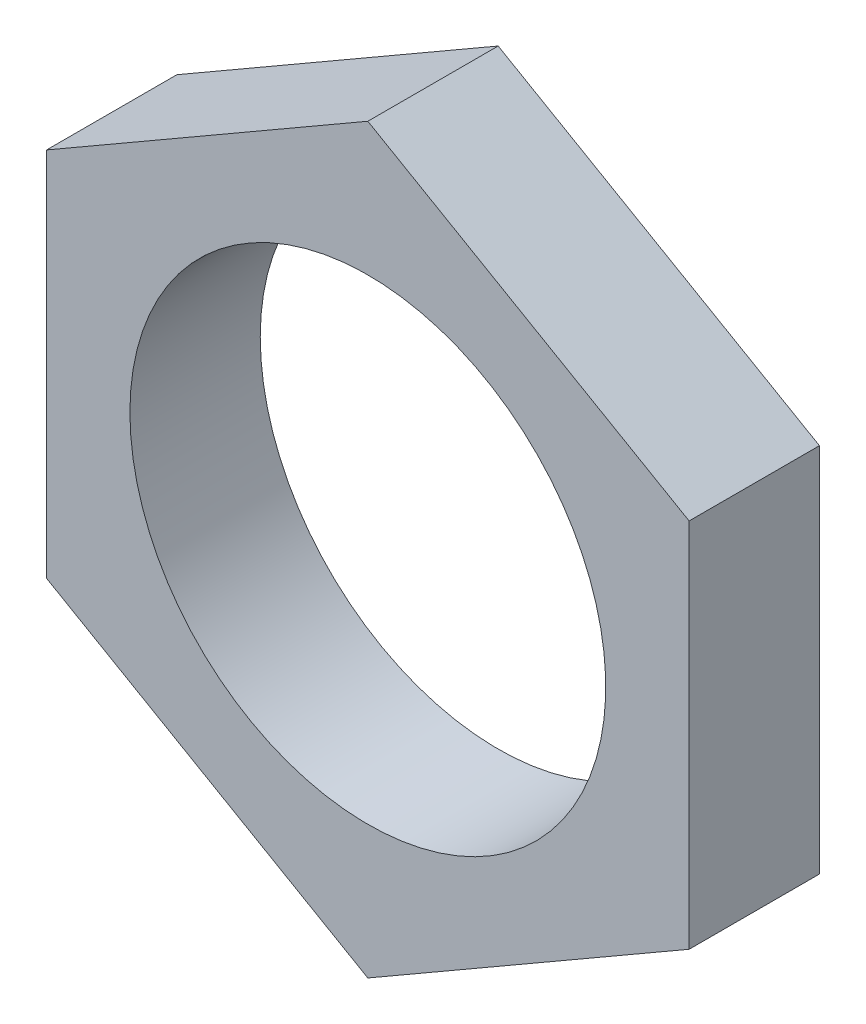
ISO-10303-21;
HEADER;
FILE_DESCRIPTION(('STEP AP214'),'2;1');
FILE_NAME('part.step','',(''),(''),'','','');
FILE_SCHEMA(('AUTOMOTIVE_DESIGN { 1 0 10303 214 1 1 1 1 }'));
ENDSEC;
DATA;
#1=APPLICATION_CONTEXT('core data for automotive mechanical design processes');
#2=APPLICATION_PROTOCOL_DEFINITION('international standard','automotive_design',2000,#1);
#3=PRODUCT_CONTEXT('',#1,'mechanical');
#4=PRODUCT('Part','Part','',(#3));
#5=PRODUCT_RELATED_PRODUCT_CATEGORY('part','',(#4));
#6=PRODUCT_DEFINITION_FORMATION('','',#4);
#7=PRODUCT_DEFINITION_CONTEXT('part definition',#1,'design');
#8=PRODUCT_DEFINITION('design','',#6,#7);
#9=PRODUCT_DEFINITION_SHAPE('','',#8);
#10=(LENGTH_UNIT() NAMED_UNIT(*) SI_UNIT(.MILLI.,.METRE.));
#11=(NAMED_UNIT(*) PLANE_ANGLE_UNIT() SI_UNIT($,.RADIAN.));
#12=(NAMED_UNIT(*) SI_UNIT($,.STERADIAN.) SOLID_ANGLE_UNIT());
#13=UNCERTAINTY_MEASURE_WITH_UNIT(LENGTH_MEASURE(1.E-05),#10,'distance_accuracy_value','');
#14=(GEOMETRIC_REPRESENTATION_CONTEXT(3) GLOBAL_UNCERTAINTY_ASSIGNED_CONTEXT((#13)) GLOBAL_UNIT_ASSIGNED_CONTEXT((#10,
#11,#12)) REPRESENTATION_CONTEXT('',''));
#15=CARTESIAN_POINT('',(0.,0.,0.));
#16=DIRECTION('',(0.,0.,1.));
#17=DIRECTION('',(1.,0.,0.));
#18=AXIS2_PLACEMENT_3D('',#15,#16,#17);
#19=CARTESIAN_POINT('',(-4.28579687329216E-13,-15.5445786476608,5.461));
#20=DIRECTION('',(-0.499999999999952,0.866025403784466,0.));
#21=DIRECTION('',(-0.866025403784466,-0.499999999999952,0.));
#22=AXIS2_PLACEMENT_3D('',#19,#20,#21);
#23=PLANE('',#22);
#24=DIRECTION('',(0.,0.,1.));
#25=VECTOR('',#24,1.);
#26=CARTESIAN_POINT('',(13.462,-7.77228932383074,5.461));
#27=LINE('',#26,#25);
#28=CARTESIAN_POINT('',(13.462,-7.77228932383075,0.));
#29=VERTEX_POINT('',#28);
#30=CARTESIAN_POINT('',(13.462,-7.77228932383076,5.461));
#31=VERTEX_POINT('',#30);
#32=EDGE_CURVE('E66',#29,#31,#27,.T.);
#33=ORIENTED_EDGE('',*,*,#32,.T.);
#34=DIRECTION('',(0.866025403784465,0.499999999999955,0.));
#35=VECTOR('',#34,1.);
#36=CARTESIAN_POINT('',(-4.28476698566271E-13,-15.5445786476608,5.461));
#37=LINE('',#36,#35);
#38=CARTESIAN_POINT('',(-4.2193953280264E-13,-15.5445786476608,5.461));
#39=VERTEX_POINT('',#38);
#40=EDGE_CURVE('E107',#39,#31,#37,.T.);
#41=ORIENTED_EDGE('',*,*,#40,.F.);
#42=DIRECTION('',(0.,0.,1.));
#43=VECTOR('',#42,1.);
#44=CARTESIAN_POINT('',(-3.98986399474666E-13,-15.5445786476607,5.461));
#45=LINE('',#44,#43);
#46=CARTESIAN_POINT('',(-4.13744623765764E-13,-15.5445786476608,0.));
#47=VERTEX_POINT('',#46);
#48=EDGE_CURVE('E94',#39,#47,#45,.F.);
#49=ORIENTED_EDGE('',*,*,#48,.T.);
#50=DIRECTION('',(0.866025403784465,0.499999999999955,0.));
#51=VECTOR('',#50,1.);
#52=CARTESIAN_POINT('',(-4.28476698566271E-13,-15.5445786476608,0.));
#53=LINE('',#52,#51);
#54=EDGE_CURVE('E108',#47,#29,#53,.T.);
#55=ORIENTED_EDGE('',*,*,#54,.T.);
#56=EDGE_LOOP('',(#33,#41,#49,#55));
#57=FACE_BOUND('',#56,.T.);
#58=ADVANCED_FACE('F17',(#57),#23,.F.);
#59=CARTESIAN_POINT('',(13.462,-7.77228932383074,5.461));
#60=DIRECTION('',(-1.,0.,0.));
#61=DIRECTION('',(0.,0.,1.));
#62=AXIS2_PLACEMENT_3D('',#59,#60,#61);
#63=PLANE('',#62);
#64=DIRECTION('',(0.,0.,1.));
#65=VECTOR('',#64,1.);
#66=CARTESIAN_POINT('',(13.462,7.77228932382927,5.461));
#67=LINE('',#66,#65);
#68=CARTESIAN_POINT('',(13.462,7.77228932382927,0.));
#69=VERTEX_POINT('',#68);
#70=CARTESIAN_POINT('',(13.462,7.77228932382927,5.461));
#71=VERTEX_POINT('',#70);
#72=EDGE_CURVE('E73',#69,#71,#67,.T.);
#73=ORIENTED_EDGE('',*,*,#72,.T.);
#74=DIRECTION('',(0.,1.,0.));
#75=VECTOR('',#74,1.);
#76=CARTESIAN_POINT('',(13.462,-7.77228932383074,5.461));
#77=LINE('',#76,#75);
#78=EDGE_CURVE('E109',#31,#71,#77,.T.);
#79=ORIENTED_EDGE('',*,*,#78,.F.);
#80=ORIENTED_EDGE('',*,*,#32,.F.);
#81=DIRECTION('',(0.,1.,0.));
#82=VECTOR('',#81,1.);
#83=CARTESIAN_POINT('',(13.462,-7.77228932383074,0.));
#84=LINE('',#83,#82);
#85=EDGE_CURVE('E87',#29,#69,#84,.T.);
#86=ORIENTED_EDGE('',*,*,#85,.T.);
#87=EDGE_LOOP('',(#73,#79,#80,#86));
#88=FACE_BOUND('',#87,.T.);
#89=ADVANCED_FACE('F93',(#88),#63,.F.);
#90=CARTESIAN_POINT('',(13.462,7.77228932382927,5.461));
#91=DIRECTION('',(-0.499999999999976,-0.866025403784453,0.));
#92=DIRECTION('',(0.866025403784453,-0.499999999999976,0.));
#93=AXIS2_PLACEMENT_3D('',#90,#91,#92);
#94=PLANE('',#93);
#95=DIRECTION('',(0.,0.,1.));
#96=VECTOR('',#95,1.);
#97=CARTESIAN_POINT('',(-8.32667268468867E-13,15.54457864766,5.461));
#98=LINE('',#97,#96);
#99=CARTESIAN_POINT('',(-8.36747552170516E-13,15.54457864766,0.));
#100=VERTEX_POINT('',#99);
#101=CARTESIAN_POINT('',(-8.36747552170516E-13,15.54457864766,5.461));
#102=VERTEX_POINT('',#101);
#103=EDGE_CURVE('E79',#100,#102,#98,.T.);
#104=ORIENTED_EDGE('',*,*,#103,.T.);
#105=DIRECTION('',(-0.866025403784452,0.499999999999976,0.));
#106=VECTOR('',#105,1.);
#107=CARTESIAN_POINT('',(13.462,7.77228932382927,5.461));
#108=LINE('',#107,#106);
#109=EDGE_CURVE('E78',#71,#102,#108,.T.);
#110=ORIENTED_EDGE('',*,*,#109,.F.);
#111=ORIENTED_EDGE('',*,*,#72,.F.);
#112=DIRECTION('',(-0.866025403784452,0.499999999999976,0.));
#113=VECTOR('',#112,1.);
#114=CARTESIAN_POINT('',(13.462,7.77228932382927,0.));
#115=LINE('',#114,#113);
#116=EDGE_CURVE('E77',#69,#100,#115,.T.);
#117=ORIENTED_EDGE('',*,*,#116,.T.);
#118=EDGE_LOOP('',(#104,#110,#111,#117));
#119=FACE_BOUND('',#118,.T.);
#120=ADVANCED_FACE('F76',(#119),#94,.F.);
#121=CARTESIAN_POINT('',(-8.32667268468867E-13,15.54457864766,5.461));
#122=DIRECTION('',(0.499999999999952,-0.866025403784466,0.));
#123=DIRECTION('',(0.866025403784466,0.499999999999952,0.));
#124=AXIS2_PLACEMENT_3D('',#121,#122,#123);
#125=PLANE('',#124);
#126=DIRECTION('',(0.,0.,-1.));
#127=VECTOR('',#126,1.);
#128=CARTESIAN_POINT('',(-13.462,7.77228932383074,5.461));
#129=LINE('',#128,#127);
#130=CARTESIAN_POINT('',(-13.462,7.77228932383073,0.));
#131=VERTEX_POINT('',#130);
#132=CARTESIAN_POINT('',(-13.462,7.77228932383074,5.461));
#133=VERTEX_POINT('',#132);
#134=EDGE_CURVE('E101',#131,#133,#129,.F.);
#135=ORIENTED_EDGE('',*,*,#134,.T.);
#136=DIRECTION('',(-0.866025403784466,-0.499999999999952,0.));
#137=VECTOR('',#136,1.);
#138=CARTESIAN_POINT('',(-8.32667268468867E-13,15.54457864766,5.461));
#139=LINE('',#138,#137);
#140=EDGE_CURVE('E111',#102,#133,#139,.T.);
#141=ORIENTED_EDGE('',*,*,#140,.F.);
#142=ORIENTED_EDGE('',*,*,#103,.F.);
#143=DIRECTION('',(-0.866025403784466,-0.499999999999952,0.));
#144=VECTOR('',#143,1.);
#145=CARTESIAN_POINT('',(-8.32667268468867E-13,15.54457864766,0.));
#146=LINE('',#145,#144);
#147=EDGE_CURVE('E91',#100,#131,#146,.T.);
#148=ORIENTED_EDGE('',*,*,#147,.T.);
#149=EDGE_LOOP('',(#135,#141,#142,#148));
#150=FACE_BOUND('',#149,.T.);
#151=ADVANCED_FACE('F123',(#150),#125,.F.);
#152=CARTESIAN_POINT('',(-13.462,7.77228932383074,5.461));
#153=DIRECTION('',(1.,0.,0.));
#154=DIRECTION('',(0.,0.,-1.));
#155=AXIS2_PLACEMENT_3D('',#152,#153,#154);
#156=PLANE('',#155);
#157=DIRECTION('',(0.,0.,1.));
#158=VECTOR('',#157,1.);
#159=CARTESIAN_POINT('',(-13.462,-7.77228932383074,5.461));
#160=LINE('',#159,#158);
#161=CARTESIAN_POINT('',(-13.462,-7.77228932383074,0.));
#162=VERTEX_POINT('',#161);
#163=CARTESIAN_POINT('',(-13.462,-7.77228932383074,5.461));
#164=VERTEX_POINT('',#163);
#165=EDGE_CURVE('E96',#162,#164,#160,.T.);
#166=ORIENTED_EDGE('',*,*,#165,.T.);
#167=DIRECTION('',(0.,1.,0.));
#168=VECTOR('',#167,1.);
#169=CARTESIAN_POINT('',(-13.462,-7.77228932383074,5.461));
#170=LINE('',#169,#168);
#171=EDGE_CURVE('E33',#133,#164,#170,.F.);
#172=ORIENTED_EDGE('',*,*,#171,.F.);
#173=ORIENTED_EDGE('',*,*,#134,.F.);
#174=DIRECTION('',(0.,1.,0.));
#175=VECTOR('',#174,1.);
#176=CARTESIAN_POINT('',(-13.462,-7.77228932383074,0.));
#177=LINE('',#176,#175);
#178=EDGE_CURVE('E120',#131,#162,#177,.F.);
#179=ORIENTED_EDGE('',*,*,#178,.T.);
#180=EDGE_LOOP('',(#166,#172,#173,#179));
#181=FACE_BOUND('',#180,.T.);
#182=ADVANCED_FACE('F149',(#181),#156,.F.);
#183=CARTESIAN_POINT('',(-13.462,-7.77228932383074,5.461));
#184=DIRECTION('',(0.499999999999976,0.866025403784453,0.));
#185=DIRECTION('',(-0.866025403784453,0.499999999999976,0.));
#186=AXIS2_PLACEMENT_3D('',#183,#184,#185);
#187=PLANE('',#186);
#188=ORIENTED_EDGE('',*,*,#48,.F.);
#189=DIRECTION('',(0.866025403784451,-0.499999999999979,0.));
#190=VECTOR('',#189,1.);
#191=CARTESIAN_POINT('',(-13.462,-7.77228932383074,5.461));
#192=LINE('',#191,#190);
#193=EDGE_CURVE('E125',#164,#39,#192,.T.);
#194=ORIENTED_EDGE('',*,*,#193,.F.);
#195=ORIENTED_EDGE('',*,*,#165,.F.);
#196=DIRECTION('',(0.866025403784451,-0.499999999999979,0.));
#197=VECTOR('',#196,1.);
#198=CARTESIAN_POINT('',(-13.462,-7.77228932383074,0.));
#199=LINE('',#198,#197);
#200=EDGE_CURVE('E117',#162,#47,#199,.T.);
#201=ORIENTED_EDGE('',*,*,#200,.T.);
#202=EDGE_LOOP('',(#188,#194,#195,#201));
#203=FACE_BOUND('',#202,.T.);
#204=ADVANCED_FACE('F146',(#203),#187,.F.);
#205=CARTESIAN_POINT('',(13.462,-7.77228932383074,0.));
#206=DIRECTION('',(0.,0.,1.));
#207=DIRECTION('',(1.,0.,0.));
#208=AXIS2_PLACEMENT_3D('',#205,#206,#207);
#209=PLANE('',#208);
#210=ORIENTED_EDGE('',*,*,#200,.F.);
#211=ORIENTED_EDGE('',*,*,#178,.F.);
#212=ORIENTED_EDGE('',*,*,#147,.F.);
#213=ORIENTED_EDGE('',*,*,#116,.F.);
#214=ORIENTED_EDGE('',*,*,#85,.F.);
#215=ORIENTED_EDGE('',*,*,#54,.F.);
#216=EDGE_LOOP('',(#210,#211,#212,#213,#214,#215));
#217=FACE_BOUND('',#216,.T.);
#218=CARTESIAN_POINT('',(0.,0.,0.));
#219=DIRECTION('',(0.,0.,-1.));
#220=DIRECTION('',(-1.,0.,0.));
#221=AXIS2_PLACEMENT_3D('',#218,#219,#220);
#222=CIRCLE('',#221,9.9695);
#223=CARTESIAN_POINT('',(-9.9695,0.,0.));
#224=VERTEX_POINT('',#223);
#225=EDGE_CURVE('E20',#224,#224,#222,.F.);
#226=ORIENTED_EDGE('',*,*,#225,.T.);
#227=EDGE_LOOP('',(#226));
#228=FACE_BOUND('',#227,.T.);
#229=ADVANCED_FACE('F84',(#217,#228),#209,.F.);
#230=CARTESIAN_POINT('',(13.462,-7.77228932383074,5.461));
#231=DIRECTION('',(0.,0.,1.));
#232=DIRECTION('',(1.,0.,0.));
#233=AXIS2_PLACEMENT_3D('',#230,#231,#232);
#234=PLANE('',#233);
#235=ORIENTED_EDGE('',*,*,#171,.T.);
#236=ORIENTED_EDGE('',*,*,#193,.T.);
#237=ORIENTED_EDGE('',*,*,#40,.T.);
#238=ORIENTED_EDGE('',*,*,#78,.T.);
#239=ORIENTED_EDGE('',*,*,#109,.T.);
#240=ORIENTED_EDGE('',*,*,#140,.T.);
#241=EDGE_LOOP('',(#235,#236,#237,#238,#239,#240));
#242=FACE_BOUND('',#241,.T.);
#243=CARTESIAN_POINT('',(0.,0.,5.461));
#244=DIRECTION('',(0.,0.,-1.));
#245=DIRECTION('',(-1.,0.,0.));
#246=AXIS2_PLACEMENT_3D('',#243,#244,#245);
#247=CIRCLE('',#246,9.9695);
#248=CARTESIAN_POINT('',(-9.9695,0.,5.461));
#249=VERTEX_POINT('',#248);
#250=EDGE_CURVE('E11',#249,#249,#247,.T.);
#251=ORIENTED_EDGE('',*,*,#250,.T.);
#252=EDGE_LOOP('',(#251));
#253=FACE_BOUND('',#252,.T.);
#254=ADVANCED_FACE('F134',(#242,#253),#234,.T.);
#255=CARTESIAN_POINT('',(0.,0.,-36.0270705544762));
#256=DIRECTION('',(0.,0.,-1.));
#257=DIRECTION('',(-1.,0.,0.));
#258=AXIS2_PLACEMENT_3D('',#255,#256,#257);
#259=CYLINDRICAL_SURFACE('',#258,9.9695);
#260=ORIENTED_EDGE('',*,*,#250,.F.);
#261=EDGE_LOOP('',(#260));
#262=FACE_BOUND('',#261,.T.);
#263=ORIENTED_EDGE('',*,*,#225,.F.);
#264=EDGE_LOOP('',(#263));
#265=FACE_BOUND('',#264,.T.);
#266=ADVANCED_FACE('F132',(#262,#265),#259,.F.);
#267=CLOSED_SHELL('',(#58,#89,#120,#151,#182,#204,#229,#254,#266));
#268=MANIFOLD_SOLID_BREP('B1',#267);
#269=ADVANCED_BREP_SHAPE_REPRESENTATION('',(#18,#268),#14);
#270=SHAPE_DEFINITION_REPRESENTATION(#9,#269);
ENDSEC;
END-ISO-10303-21;
